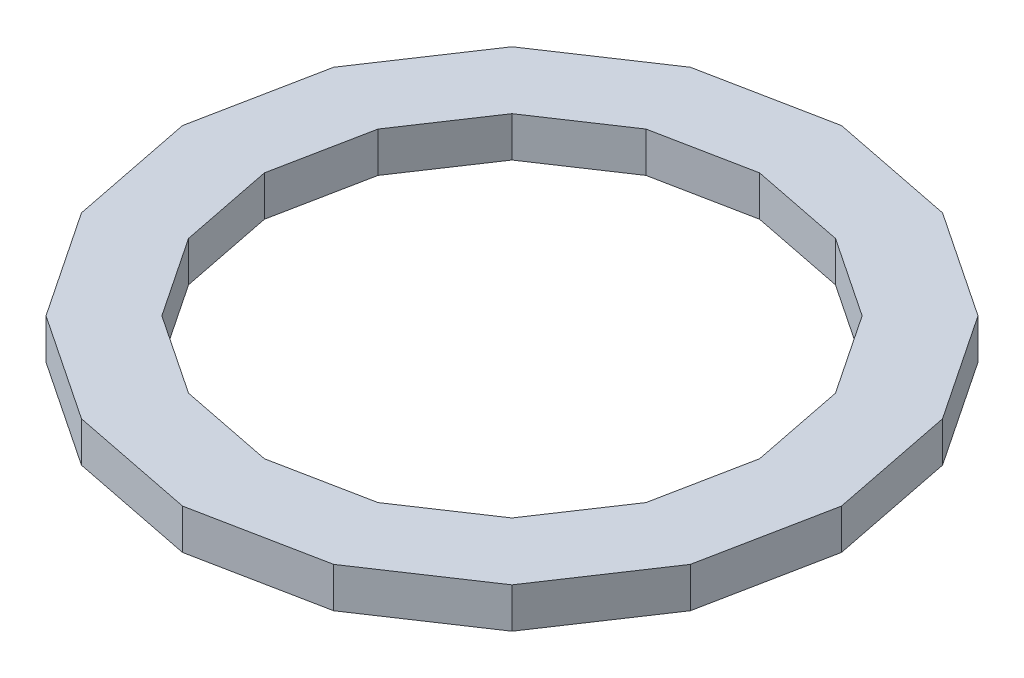
ISO-10303-21;
HEADER;
FILE_DESCRIPTION(('STEP AP214'),'2;1');
FILE_NAME('part.step','',(''),(''),'','','');
FILE_SCHEMA(('AUTOMOTIVE_DESIGN { 1 0 10303 214 1 1 1 1 }'));
ENDSEC;
DATA;
#1=APPLICATION_CONTEXT('core data for automotive mechanical design processes');
#2=APPLICATION_PROTOCOL_DEFINITION('international standard','automotive_design',2000,#1);
#3=PRODUCT_CONTEXT('',#1,'mechanical');
#4=PRODUCT('Part','Part','',(#3));
#5=PRODUCT_RELATED_PRODUCT_CATEGORY('part','',(#4));
#6=PRODUCT_DEFINITION_FORMATION('','',#4);
#7=PRODUCT_DEFINITION_CONTEXT('part definition',#1,'design');
#8=PRODUCT_DEFINITION('design','',#6,#7);
#9=PRODUCT_DEFINITION_SHAPE('','',#8);
#10=(LENGTH_UNIT() NAMED_UNIT(*) SI_UNIT(.MILLI.,.METRE.));
#11=(NAMED_UNIT(*) PLANE_ANGLE_UNIT() SI_UNIT($,.RADIAN.));
#12=(NAMED_UNIT(*) SI_UNIT($,.STERADIAN.) SOLID_ANGLE_UNIT());
#13=UNCERTAINTY_MEASURE_WITH_UNIT(LENGTH_MEASURE(1.E-05),#10,'distance_accuracy_value','');
#14=(GEOMETRIC_REPRESENTATION_CONTEXT(3) GLOBAL_UNCERTAINTY_ASSIGNED_CONTEXT((#13)) GLOBAL_UNIT_ASSIGNED_CONTEXT((#10,
#11,#12)) REPRESENTATION_CONTEXT('',''));
#15=CARTESIAN_POINT('',(0.,0.,0.));
#16=DIRECTION('',(0.,0.,1.));
#17=DIRECTION('',(1.,0.,0.));
#18=AXIS2_PLACEMENT_3D('',#15,#16,#17);
#19=CARTESIAN_POINT('',(0.,19.05,0.));
#20=DIRECTION('',(0.,1.,0.));
#21=DIRECTION('',(0.,0.,1.));
#22=AXIS2_PLACEMENT_3D('',#19,#20,#21);
#23=PLANE('',#22);
#24=DIRECTION('',(0.195090322016117,0.,-0.980785280403233));
#25=VECTOR('',#24,1.);
#26=CARTESIAN_POINT('',(144.34261966422,19.05,59.7886706933792));
#27=LINE('',#26,#25);
#28=CARTESIAN_POINT('',(144.34261966422,19.05,59.7886706933792));
#29=VERTEX_POINT('',#28);
#30=CARTESIAN_POINT('',(156.235325694322,19.05,-1.75900703643039E-12));
#31=VERTEX_POINT('',#30);
#32=EDGE_CURVE('E376',#29,#31,#27,.T.);
#33=ORIENTED_EDGE('',*,*,#32,.T.);
#34=DIRECTION('',(-0.19509032201614,0.,-0.980785280403228));
#35=VECTOR('',#34,1.);
#36=CARTESIAN_POINT('',(156.235325694322,19.05,-1.75900703643039E-12));
#37=LINE('',#36,#35);
#38=CARTESIAN_POINT('',(144.342619664218,19.05,-59.7886706933826));
#39=VERTEX_POINT('',#38);
#40=EDGE_CURVE('E379',#31,#39,#37,.T.);
#41=ORIENTED_EDGE('',*,*,#40,.T.);
#42=DIRECTION('',(-0.555570233019612,0.,-0.831469612302539));
#43=VECTOR('',#42,1.);
#44=CARTESIAN_POINT('',(144.342619664218,19.05,-59.7886706933826));
#45=LINE('',#44,#43);
#46=CARTESIAN_POINT('',(110.475058259343,19.05,-110.475058259345));
#47=VERTEX_POINT('',#46);
#48=EDGE_CURVE('E382',#39,#47,#45,.T.);
#49=ORIENTED_EDGE('',*,*,#48,.T.);
#50=DIRECTION('',(-0.831469612302552,0.,-0.555570233019593));
#51=VECTOR('',#50,1.);
#52=CARTESIAN_POINT('',(110.475058259343,19.05,-110.475058259345));
#53=LINE('',#52,#51);
#54=CARTESIAN_POINT('',(59.7886706933792,19.05,-144.34261966422));
#55=VERTEX_POINT('',#54);
#56=EDGE_CURVE('E384',#47,#55,#53,.T.);
#57=ORIENTED_EDGE('',*,*,#56,.T.);
#58=DIRECTION('',(-0.980785280403233,0.,-0.195090322016116));
#59=VECTOR('',#58,1.);
#60=CARTESIAN_POINT('',(59.7886706933792,19.05,-144.34261966422));
#61=LINE('',#60,#59);
#62=CARTESIAN_POINT('',(-1.74314644440105E-12,19.05,-156.235325694322));
#63=VERTEX_POINT('',#62);
#64=EDGE_CURVE('E386',#55,#63,#61,.T.);
#65=ORIENTED_EDGE('',*,*,#64,.T.);
#66=DIRECTION('',(-0.980785280403228,0.,0.195090322016139));
#67=VECTOR('',#66,1.);
#68=CARTESIAN_POINT('',(-1.74314644440105E-12,19.05,-156.235325694322));
#69=LINE('',#68,#67);
#70=CARTESIAN_POINT('',(-59.7886706933825,19.05,-144.342619664218));
#71=VERTEX_POINT('',#70);
#72=EDGE_CURVE('E388',#63,#71,#69,.T.);
#73=ORIENTED_EDGE('',*,*,#72,.T.);
#74=DIRECTION('',(-0.831469612302539,0.,0.555570233019612));
#75=VECTOR('',#74,1.);
#76=CARTESIAN_POINT('',(-59.7886706933825,19.05,-144.342619664218));
#77=LINE('',#76,#75);
#78=CARTESIAN_POINT('',(-110.475058259345,19.05,-110.475058259343));
#79=VERTEX_POINT('',#78);
#80=EDGE_CURVE('E390',#71,#79,#77,.T.);
#81=ORIENTED_EDGE('',*,*,#80,.T.);
#82=DIRECTION('',(-0.555570233019593,0.,0.831469612302552));
#83=VECTOR('',#82,1.);
#84=CARTESIAN_POINT('',(-110.475058259345,19.05,-110.475058259343));
#85=LINE('',#84,#83);
#86=CARTESIAN_POINT('',(-144.34261966422,19.05,-59.7886706933791));
#87=VERTEX_POINT('',#86);
#88=EDGE_CURVE('E392',#79,#87,#85,.T.);
#89=ORIENTED_EDGE('',*,*,#88,.T.);
#90=DIRECTION('',(-0.195090322016117,0.,0.980785280403233));
#91=VECTOR('',#90,1.);
#92=CARTESIAN_POINT('',(-144.34261966422,19.05,-59.7886706933791));
#93=LINE('',#92,#91);
#94=CARTESIAN_POINT('',(-156.235325694322,19.05,1.81308112107717E-12));
#95=VERTEX_POINT('',#94);
#96=EDGE_CURVE('E395',#87,#95,#93,.T.);
#97=ORIENTED_EDGE('',*,*,#96,.T.);
#98=DIRECTION('',(0.195090322016139,0.,0.980785280403228));
#99=VECTOR('',#98,1.);
#100=CARTESIAN_POINT('',(-156.235325694322,19.05,1.81308112107717E-12));
#101=LINE('',#100,#99);
#102=CARTESIAN_POINT('',(-144.342619664218,19.05,59.7886706933825));
#103=VERTEX_POINT('',#102);
#104=EDGE_CURVE('E397',#95,#103,#101,.T.);
#105=ORIENTED_EDGE('',*,*,#104,.T.);
#106=DIRECTION('',(0.555570233019612,0.,0.831469612302539));
#107=VECTOR('',#106,1.);
#108=CARTESIAN_POINT('',(-144.342619664218,19.05,59.7886706933825));
#109=LINE('',#108,#107);
#110=CARTESIAN_POINT('',(-110.475058259343,19.05,110.475058259345));
#111=VERTEX_POINT('',#110);
#112=EDGE_CURVE('E399',#103,#111,#109,.T.);
#113=ORIENTED_EDGE('',*,*,#112,.T.);
#114=DIRECTION('',(0.831469612302552,0.,0.555570233019593));
#115=VECTOR('',#114,1.);
#116=CARTESIAN_POINT('',(-110.475058259343,19.05,110.475058259345));
#117=LINE('',#116,#115);
#118=CARTESIAN_POINT('',(-59.7886706933792,19.05,144.34261966422));
#119=VERTEX_POINT('',#118);
#120=EDGE_CURVE('E402',#111,#119,#117,.T.);
#121=ORIENTED_EDGE('',*,*,#120,.T.);
#122=DIRECTION('',(0.980785280403233,0.,0.195090322016117));
#123=VECTOR('',#122,1.);
#124=CARTESIAN_POINT('',(-59.7886706933792,19.05,144.34261966422));
#125=LINE('',#124,#123);
#126=CARTESIAN_POINT('',(1.82717706537178E-12,19.05,156.235325694322));
#127=VERTEX_POINT('',#126);
#128=EDGE_CURVE('E405',#119,#127,#125,.T.);
#129=ORIENTED_EDGE('',*,*,#128,.T.);
#130=DIRECTION('',(0.980785280403228,0.,-0.195090322016139));
#131=VECTOR('',#130,1.);
#132=CARTESIAN_POINT('',(1.82717706537178E-12,19.05,156.235325694322));
#133=LINE('',#132,#131);
#134=CARTESIAN_POINT('',(59.7886706933825,19.05,144.342619664218));
#135=VERTEX_POINT('',#134);
#136=EDGE_CURVE('E407',#127,#135,#133,.T.);
#137=ORIENTED_EDGE('',*,*,#136,.T.);
#138=DIRECTION('',(0.831469612302539,0.,-0.555570233019612));
#139=VECTOR('',#138,1.);
#140=CARTESIAN_POINT('',(59.7886706933825,19.05,144.342619664218));
#141=LINE('',#140,#139);
#142=CARTESIAN_POINT('',(110.475058259345,19.05,110.475058259343));
#143=VERTEX_POINT('',#142);
#144=EDGE_CURVE('E410',#135,#143,#141,.T.);
#145=ORIENTED_EDGE('',*,*,#144,.T.);
#146=DIRECTION('',(0.555570233019592,0.,-0.831469612302552));
#147=VECTOR('',#146,1.);
#148=CARTESIAN_POINT('',(110.475058259345,19.05,110.475058259343));
#149=LINE('',#148,#147);
#150=EDGE_CURVE('E413',#143,#29,#149,.T.);
#151=ORIENTED_EDGE('',*,*,#150,.T.);
#152=EDGE_LOOP('',(#33,#41,#49,#57,#65,#73,#81,#89,#97,#105,#113,#121,#129,#137,#145,#151));
#153=FACE_BOUND('',#152,.T.);
#154=DIRECTION('',(-0.195090322016139,0.,-0.980785280403228));
#155=VECTOR('',#154,1.);
#156=CARTESIAN_POINT('',(117.388902566585,19.05,-1.41484433577876E-12));
#157=LINE('',#156,#155);
#158=CARTESIAN_POINT('',(117.388902566585,19.05,-1.41484433577876E-12));
#159=VERTEX_POINT('',#158);
#160=CARTESIAN_POINT('',(108.453204425229,19.05,-44.9227881557531));
#161=VERTEX_POINT('',#160);
#162=EDGE_CURVE('E252',#159,#161,#157,.T.);
#163=ORIENTED_EDGE('',*,*,#162,.F.);
#164=DIRECTION('',(0.195090322016117,0.,-0.980785280403233));
#165=VECTOR('',#164,1.);
#166=CARTESIAN_POINT('',(108.45320442523,19.05,44.9227881557506));
#167=LINE('',#166,#165);
#168=CARTESIAN_POINT('',(108.45320442523,19.05,44.9227881557506));
#169=VERTEX_POINT('',#168);
#170=EDGE_CURVE('E243',#169,#159,#167,.T.);
#171=ORIENTED_EDGE('',*,*,#170,.F.);
#172=DIRECTION('',(0.555570233019592,0.,-0.831469612302552));
#173=VECTOR('',#172,1.);
#174=CARTESIAN_POINT('',(83.0064890408802,19.05,83.0064890408783));
#175=LINE('',#174,#173);
#176=CARTESIAN_POINT('',(83.0064890408802,19.05,83.0064890408783));
#177=VERTEX_POINT('',#176);
#178=EDGE_CURVE('E296',#177,#169,#175,.T.);
#179=ORIENTED_EDGE('',*,*,#178,.F.);
#180=DIRECTION('',(0.831469612302539,0.,-0.555570233019612));
#181=VECTOR('',#180,1.);
#182=CARTESIAN_POINT('',(44.9227881557531,19.05,108.453204425229));
#183=LINE('',#182,#181);
#184=CARTESIAN_POINT('',(44.9227881557531,19.05,108.453204425229));
#185=VERTEX_POINT('',#184);
#186=EDGE_CURVE('E294',#185,#177,#183,.T.);
#187=ORIENTED_EDGE('',*,*,#186,.F.);
#188=DIRECTION('',(0.980785280403228,0.,-0.195090322016139));
#189=VECTOR('',#188,1.);
#190=CARTESIAN_POINT('',(1.35112482696358E-12,19.05,117.388902566585));
#191=LINE('',#190,#189);
#192=CARTESIAN_POINT('',(1.35112482696358E-12,19.05,117.388902566585));
#193=VERTEX_POINT('',#192);
#194=EDGE_CURVE('E292',#193,#185,#191,.T.);
#195=ORIENTED_EDGE('',*,*,#194,.F.);
#196=DIRECTION('',(0.980785280403233,0.,0.195090322016117));
#197=VECTOR('',#196,1.);
#198=CARTESIAN_POINT('',(-44.9227881557506,19.05,108.45320442523));
#199=LINE('',#198,#197);
#200=CARTESIAN_POINT('',(-44.9227881557506,19.05,108.45320442523));
#201=VERTEX_POINT('',#200);
#202=EDGE_CURVE('E290',#201,#193,#199,.T.);
#203=ORIENTED_EDGE('',*,*,#202,.F.);
#204=DIRECTION('',(0.831469612302552,0.,0.555570233019592));
#205=VECTOR('',#204,1.);
#206=CARTESIAN_POINT('',(-83.0064890408783,19.05,83.0064890408802));
#207=LINE('',#206,#205);
#208=CARTESIAN_POINT('',(-83.0064890408783,19.05,83.0064890408802));
#209=VERTEX_POINT('',#208);
#210=EDGE_CURVE('E288',#209,#201,#207,.T.);
#211=ORIENTED_EDGE('',*,*,#210,.F.);
#212=DIRECTION('',(0.555570233019612,0.,0.831469612302539));
#213=VECTOR('',#212,1.);
#214=CARTESIAN_POINT('',(-108.453204425229,19.05,44.9227881557532));
#215=LINE('',#214,#213);
#216=CARTESIAN_POINT('',(-108.453204425229,19.05,44.9227881557532));
#217=VERTEX_POINT('',#216);
#218=EDGE_CURVE('E285',#217,#209,#215,.T.);
#219=ORIENTED_EDGE('',*,*,#218,.F.);
#220=DIRECTION('',(0.19509032201614,0.,0.980785280403228));
#221=VECTOR('',#220,1.);
#222=CARTESIAN_POINT('',(-117.388902566585,19.05,1.38127980801458E-12));
#223=LINE('',#222,#221);
#224=CARTESIAN_POINT('',(-117.388902566585,19.05,1.38127980801458E-12));
#225=VERTEX_POINT('',#224);
#226=EDGE_CURVE('E283',#225,#217,#223,.T.);
#227=ORIENTED_EDGE('',*,*,#226,.F.);
#228=DIRECTION('',(-0.195090322016117,0.,0.980785280403233));
#229=VECTOR('',#228,1.);
#230=CARTESIAN_POINT('',(-108.45320442523,19.05,-44.9227881557506));
#231=LINE('',#230,#229);
#232=CARTESIAN_POINT('',(-108.45320442523,19.05,-44.9227881557506));
#233=VERTEX_POINT('',#232);
#234=EDGE_CURVE('E280',#233,#225,#231,.T.);
#235=ORIENTED_EDGE('',*,*,#234,.F.);
#236=DIRECTION('',(-0.555570233019592,0.,0.831469612302552));
#237=VECTOR('',#236,1.);
#238=CARTESIAN_POINT('',(-83.0064890408802,19.05,-83.0064890408783));
#239=LINE('',#238,#237);
#240=CARTESIAN_POINT('',(-83.0064890408802,19.05,-83.0064890408783));
#241=VERTEX_POINT('',#240);
#242=EDGE_CURVE('E277',#241,#233,#239,.T.);
#243=ORIENTED_EDGE('',*,*,#242,.F.);
#244=DIRECTION('',(-0.831469612302539,0.,0.555570233019612));
#245=VECTOR('',#244,1.);
#246=CARTESIAN_POINT('',(-44.9227881557531,19.05,-108.453204425229));
#247=LINE('',#246,#245);
#248=CARTESIAN_POINT('',(-44.9227881557531,19.05,-108.453204425229));
#249=VERTEX_POINT('',#248);
#250=EDGE_CURVE('E275',#249,#241,#247,.T.);
#251=ORIENTED_EDGE('',*,*,#250,.F.);
#252=DIRECTION('',(-0.980785280403228,0.,0.19509032201614));
#253=VECTOR('',#252,1.);
#254=CARTESIAN_POINT('',(-1.40097410009201E-12,19.05,-117.388902566585));
#255=LINE('',#254,#253);
#256=CARTESIAN_POINT('',(-1.40097410009201E-12,19.05,-117.388902566585));
#257=VERTEX_POINT('',#256);
#258=EDGE_CURVE('E273',#257,#249,#255,.T.);
#259=ORIENTED_EDGE('',*,*,#258,.F.);
#260=DIRECTION('',(-0.980785280403233,0.,-0.195090322016117));
#261=VECTOR('',#260,1.);
#262=CARTESIAN_POINT('',(44.9227881557507,19.05,-108.45320442523));
#263=LINE('',#262,#261);
#264=CARTESIAN_POINT('',(44.9227881557507,19.05,-108.45320442523));
#265=VERTEX_POINT('',#264);
#266=EDGE_CURVE('E271',#265,#257,#263,.T.);
#267=ORIENTED_EDGE('',*,*,#266,.F.);
#268=DIRECTION('',(-0.831469612302552,0.,-0.555570233019593));
#269=VECTOR('',#268,1.);
#270=CARTESIAN_POINT('',(83.0064890408783,19.05,-83.0064890408802));
#271=LINE('',#270,#269);
#272=CARTESIAN_POINT('',(83.0064890408783,19.05,-83.0064890408802));
#273=VERTEX_POINT('',#272);
#274=EDGE_CURVE('E267',#273,#265,#271,.T.);
#275=ORIENTED_EDGE('',*,*,#274,.F.);
#276=DIRECTION('',(-0.555570233019612,0.,-0.831469612302539));
#277=VECTOR('',#276,1.);
#278=CARTESIAN_POINT('',(108.453204425229,19.05,-44.9227881557531));
#279=LINE('',#278,#277);
#280=EDGE_CURVE('E265',#161,#273,#279,.T.);
#281=ORIENTED_EDGE('',*,*,#280,.F.);
#282=EDGE_LOOP('',(#163,#171,#179,#187,#195,#203,#211,#219,#227,#235,#243,#251,#259,#267,#275,#281));
#283=FACE_BOUND('',#282,.T.);
#284=ADVANCED_FACE('F34',(#153,#283),#23,.T.);
#285=CARTESIAN_POINT('',(0.,0.,0.));
#286=DIRECTION('',(0.,1.,0.));
#287=DIRECTION('',(0.,0.,1.));
#288=AXIS2_PLACEMENT_3D('',#285,#286,#287);
#289=PLANE('',#288);
#290=DIRECTION('',(0.195090322016117,0.,-0.980785280403233));
#291=VECTOR('',#290,1.);
#292=CARTESIAN_POINT('',(144.34261966422,0.,59.7886706933792));
#293=LINE('',#292,#291);
#294=CARTESIAN_POINT('',(144.34261966422,0.,59.7886706933792));
#295=VERTEX_POINT('',#294);
#296=CARTESIAN_POINT('',(156.235325694322,0.,-1.75900703643039E-12));
#297=VERTEX_POINT('',#296);
#298=EDGE_CURVE('E260',#295,#297,#293,.T.);
#299=ORIENTED_EDGE('',*,*,#298,.F.);
#300=DIRECTION('',(0.555570233019592,0.,-0.831469612302552));
#301=VECTOR('',#300,1.);
#302=CARTESIAN_POINT('',(110.475058259345,0.,110.475058259343));
#303=LINE('',#302,#301);
#304=CARTESIAN_POINT('',(110.475058259345,0.,110.475058259343));
#305=VERTEX_POINT('',#304);
#306=EDGE_CURVE('E380',#305,#295,#303,.T.);
#307=ORIENTED_EDGE('',*,*,#306,.F.);
#308=DIRECTION('',(0.831469612302539,0.,-0.555570233019612));
#309=VECTOR('',#308,1.);
#310=CARTESIAN_POINT('',(59.7886706933825,0.,144.342619664218));
#311=LINE('',#310,#309);
#312=CARTESIAN_POINT('',(59.7886706933825,0.,144.342619664218));
#313=VERTEX_POINT('',#312);
#314=EDGE_CURVE('E448',#313,#305,#311,.T.);
#315=ORIENTED_EDGE('',*,*,#314,.F.);
#316=DIRECTION('',(0.980785280403228,0.,-0.195090322016139));
#317=VECTOR('',#316,1.);
#318=CARTESIAN_POINT('',(1.82717706537178E-12,0.,156.235325694322));
#319=LINE('',#318,#317);
#320=CARTESIAN_POINT('',(1.82717706537178E-12,0.,156.235325694322));
#321=VERTEX_POINT('',#320);
#322=EDGE_CURVE('E445',#321,#313,#319,.T.);
#323=ORIENTED_EDGE('',*,*,#322,.F.);
#324=DIRECTION('',(0.980785280403233,0.,0.195090322016117));
#325=VECTOR('',#324,1.);
#326=CARTESIAN_POINT('',(-59.7886706933792,0.,144.34261966422));
#327=LINE('',#326,#325);
#328=CARTESIAN_POINT('',(-59.7886706933792,0.,144.34261966422));
#329=VERTEX_POINT('',#328);
#330=EDGE_CURVE('E442',#329,#321,#327,.T.);
#331=ORIENTED_EDGE('',*,*,#330,.F.);
#332=DIRECTION('',(0.831469612302552,0.,0.555570233019593));
#333=VECTOR('',#332,1.);
#334=CARTESIAN_POINT('',(-110.475058259343,0.,110.475058259345));
#335=LINE('',#334,#333);
#336=CARTESIAN_POINT('',(-110.475058259343,0.,110.475058259345));
#337=VERTEX_POINT('',#336);
#338=EDGE_CURVE('E439',#337,#329,#335,.T.);
#339=ORIENTED_EDGE('',*,*,#338,.F.);
#340=DIRECTION('',(0.555570233019612,0.,0.831469612302539));
#341=VECTOR('',#340,1.);
#342=CARTESIAN_POINT('',(-144.342619664218,0.,59.7886706933825));
#343=LINE('',#342,#341);
#344=CARTESIAN_POINT('',(-144.342619664218,0.,59.7886706933825));
#345=VERTEX_POINT('',#344);
#346=EDGE_CURVE('E437',#345,#337,#343,.T.);
#347=ORIENTED_EDGE('',*,*,#346,.F.);
#348=DIRECTION('',(0.195090322016139,0.,0.980785280403228));
#349=VECTOR('',#348,1.);
#350=CARTESIAN_POINT('',(-156.235325694322,0.,1.81308112107717E-12));
#351=LINE('',#350,#349);
#352=CARTESIAN_POINT('',(-156.235325694322,0.,1.81308112107717E-12));
#353=VERTEX_POINT('',#352);
#354=EDGE_CURVE('E434',#353,#345,#351,.T.);
#355=ORIENTED_EDGE('',*,*,#354,.F.);
#356=DIRECTION('',(-0.195090322016117,0.,0.980785280403233));
#357=VECTOR('',#356,1.);
#358=CARTESIAN_POINT('',(-144.34261966422,0.,-59.7886706933791));
#359=LINE('',#358,#357);
#360=CARTESIAN_POINT('',(-144.34261966422,0.,-59.7886706933791));
#361=VERTEX_POINT('',#360);
#362=EDGE_CURVE('E432',#361,#353,#359,.T.);
#363=ORIENTED_EDGE('',*,*,#362,.F.);
#364=DIRECTION('',(-0.555570233019593,0.,0.831469612302552));
#365=VECTOR('',#364,1.);
#366=CARTESIAN_POINT('',(-110.475058259345,0.,-110.475058259343));
#367=LINE('',#366,#365);
#368=CARTESIAN_POINT('',(-110.475058259345,0.,-110.475058259343));
#369=VERTEX_POINT('',#368);
#370=EDGE_CURVE('E430',#369,#361,#367,.T.);
#371=ORIENTED_EDGE('',*,*,#370,.F.);
#372=DIRECTION('',(-0.831469612302539,0.,0.555570233019612));
#373=VECTOR('',#372,1.);
#374=CARTESIAN_POINT('',(-59.7886706933825,0.,-144.342619664218));
#375=LINE('',#374,#373);
#376=CARTESIAN_POINT('',(-59.7886706933825,0.,-144.342619664218));
#377=VERTEX_POINT('',#376);
#378=EDGE_CURVE('E428',#377,#369,#375,.T.);
#379=ORIENTED_EDGE('',*,*,#378,.F.);
#380=DIRECTION('',(-0.980785280403228,0.,0.195090322016139));
#381=VECTOR('',#380,1.);
#382=CARTESIAN_POINT('',(-1.74314644440105E-12,0.,-156.235325694322));
#383=LINE('',#382,#381);
#384=CARTESIAN_POINT('',(-1.74314644440105E-12,0.,-156.235325694322));
#385=VERTEX_POINT('',#384);
#386=EDGE_CURVE('E426',#385,#377,#383,.T.);
#387=ORIENTED_EDGE('',*,*,#386,.F.);
#388=DIRECTION('',(-0.980785280403233,0.,-0.195090322016116));
#389=VECTOR('',#388,1.);
#390=CARTESIAN_POINT('',(59.7886706933792,0.,-144.34261966422));
#391=LINE('',#390,#389);
#392=CARTESIAN_POINT('',(59.7886706933792,0.,-144.34261966422));
#393=VERTEX_POINT('',#392);
#394=EDGE_CURVE('E424',#393,#385,#391,.T.);
#395=ORIENTED_EDGE('',*,*,#394,.F.);
#396=DIRECTION('',(-0.831469612302552,0.,-0.555570233019593));
#397=VECTOR('',#396,1.);
#398=CARTESIAN_POINT('',(110.475058259343,0.,-110.475058259345));
#399=LINE('',#398,#397);
#400=CARTESIAN_POINT('',(110.475058259343,0.,-110.475058259345));
#401=VERTEX_POINT('',#400);
#402=EDGE_CURVE('E422',#401,#393,#399,.T.);
#403=ORIENTED_EDGE('',*,*,#402,.F.);
#404=DIRECTION('',(-0.555570233019612,0.,-0.831469612302539));
#405=VECTOR('',#404,1.);
#406=CARTESIAN_POINT('',(144.342619664218,0.,-59.7886706933826));
#407=LINE('',#406,#405);
#408=CARTESIAN_POINT('',(144.342619664218,0.,-59.7886706933826));
#409=VERTEX_POINT('',#408);
#410=EDGE_CURVE('E420',#409,#401,#407,.T.);
#411=ORIENTED_EDGE('',*,*,#410,.F.);
#412=DIRECTION('',(-0.19509032201614,0.,-0.980785280403228));
#413=VECTOR('',#412,1.);
#414=CARTESIAN_POINT('',(156.235325694322,0.,-1.75900703643039E-12));
#415=LINE('',#414,#413);
#416=EDGE_CURVE('E418',#297,#409,#415,.T.);
#417=ORIENTED_EDGE('',*,*,#416,.F.);
#418=EDGE_LOOP('',(#299,#307,#315,#323,#331,#339,#347,#355,#363,#371,#379,#387,#395,#403,#411,#417));
#419=FACE_BOUND('',#418,.T.);
#420=DIRECTION('',(0.195090322016117,0.,-0.980785280403233));
#421=VECTOR('',#420,1.);
#422=CARTESIAN_POINT('',(108.45320442523,0.,44.9227881557506));
#423=LINE('',#422,#421);
#424=CARTESIAN_POINT('',(108.45320442523,0.,44.9227881557506));
#425=VERTEX_POINT('',#424);
#426=CARTESIAN_POINT('',(117.388902566585,0.,-1.41484433577876E-12));
#427=VERTEX_POINT('',#426);
#428=EDGE_CURVE('E57',#425,#427,#423,.T.);
#429=ORIENTED_EDGE('',*,*,#428,.T.);
#430=DIRECTION('',(-0.195090322016139,0.,-0.980785280403228));
#431=VECTOR('',#430,1.);
#432=CARTESIAN_POINT('',(117.388902566585,0.,-1.41484433577876E-12));
#433=LINE('',#432,#431);
#434=CARTESIAN_POINT('',(108.453204425229,0.,-44.9227881557531));
#435=VERTEX_POINT('',#434);
#436=EDGE_CURVE('E259',#427,#435,#433,.T.);
#437=ORIENTED_EDGE('',*,*,#436,.T.);
#438=DIRECTION('',(-0.555570233019612,0.,-0.831469612302539));
#439=VECTOR('',#438,1.);
#440=CARTESIAN_POINT('',(108.453204425229,0.,-44.9227881557531));
#441=LINE('',#440,#439);
#442=CARTESIAN_POINT('',(83.0064890408783,0.,-83.0064890408802));
#443=VERTEX_POINT('',#442);
#444=EDGE_CURVE('E300',#435,#443,#441,.T.);
#445=ORIENTED_EDGE('',*,*,#444,.T.);
#446=DIRECTION('',(-0.831469612302552,0.,-0.555570233019593));
#447=VECTOR('',#446,1.);
#448=CARTESIAN_POINT('',(83.0064890408783,0.,-83.0064890408802));
#449=LINE('',#448,#447);
#450=CARTESIAN_POINT('',(44.9227881557507,0.,-108.45320442523));
#451=VERTEX_POINT('',#450);
#452=EDGE_CURVE('E303',#443,#451,#449,.T.);
#453=ORIENTED_EDGE('',*,*,#452,.T.);
#454=DIRECTION('',(-0.980785280403233,0.,-0.195090322016117));
#455=VECTOR('',#454,1.);
#456=CARTESIAN_POINT('',(44.9227881557507,0.,-108.45320442523));
#457=LINE('',#456,#455);
#458=CARTESIAN_POINT('',(-1.40097410009201E-12,0.,-117.388902566585));
#459=VERTEX_POINT('',#458);
#460=EDGE_CURVE('E306',#451,#459,#457,.T.);
#461=ORIENTED_EDGE('',*,*,#460,.T.);
#462=DIRECTION('',(-0.980785280403228,0.,0.19509032201614));
#463=VECTOR('',#462,1.);
#464=CARTESIAN_POINT('',(-1.40097410009201E-12,0.,-117.388902566585));
#465=LINE('',#464,#463);
#466=CARTESIAN_POINT('',(-44.9227881557531,0.,-108.453204425229));
#467=VERTEX_POINT('',#466);
#468=EDGE_CURVE('E310',#459,#467,#465,.T.);
#469=ORIENTED_EDGE('',*,*,#468,.T.);
#470=DIRECTION('',(-0.831469612302539,0.,0.555570233019612));
#471=VECTOR('',#470,1.);
#472=CARTESIAN_POINT('',(-44.9227881557531,0.,-108.453204425229));
#473=LINE('',#472,#471);
#474=CARTESIAN_POINT('',(-83.0064890408802,0.,-83.0064890408783));
#475=VERTEX_POINT('',#474);
#476=EDGE_CURVE('E313',#467,#475,#473,.T.);
#477=ORIENTED_EDGE('',*,*,#476,.T.);
#478=DIRECTION('',(-0.555570233019592,0.,0.831469612302552));
#479=VECTOR('',#478,1.);
#480=CARTESIAN_POINT('',(-83.0064890408802,0.,-83.0064890408783));
#481=LINE('',#480,#479);
#482=CARTESIAN_POINT('',(-108.45320442523,0.,-44.9227881557506));
#483=VERTEX_POINT('',#482);
#484=EDGE_CURVE('E316',#475,#483,#481,.T.);
#485=ORIENTED_EDGE('',*,*,#484,.T.);
#486=DIRECTION('',(-0.195090322016117,0.,0.980785280403233));
#487=VECTOR('',#486,1.);
#488=CARTESIAN_POINT('',(-108.45320442523,0.,-44.9227881557506));
#489=LINE('',#488,#487);
#490=CARTESIAN_POINT('',(-117.388902566585,0.,1.38127980801458E-12));
#491=VERTEX_POINT('',#490);
#492=EDGE_CURVE('E319',#483,#491,#489,.T.);
#493=ORIENTED_EDGE('',*,*,#492,.T.);
#494=DIRECTION('',(0.19509032201614,0.,0.980785280403228));
#495=VECTOR('',#494,1.);
#496=CARTESIAN_POINT('',(-117.388902566585,0.,1.38127980801458E-12));
#497=LINE('',#496,#495);
#498=CARTESIAN_POINT('',(-108.453204425229,0.,44.9227881557532));
#499=VERTEX_POINT('',#498);
#500=EDGE_CURVE('E323',#491,#499,#497,.T.);
#501=ORIENTED_EDGE('',*,*,#500,.T.);
#502=DIRECTION('',(0.555570233019612,0.,0.831469612302539));
#503=VECTOR('',#502,1.);
#504=CARTESIAN_POINT('',(-108.453204425229,0.,44.9227881557532));
#505=LINE('',#504,#503);
#506=CARTESIAN_POINT('',(-83.0064890408783,0.,83.0064890408802));
#507=VERTEX_POINT('',#506);
#508=EDGE_CURVE('E326',#499,#507,#505,.T.);
#509=ORIENTED_EDGE('',*,*,#508,.T.);
#510=DIRECTION('',(0.831469612302552,0.,0.555570233019592));
#511=VECTOR('',#510,1.);
#512=CARTESIAN_POINT('',(-83.0064890408783,0.,83.0064890408802));
#513=LINE('',#512,#511);
#514=CARTESIAN_POINT('',(-44.9227881557506,0.,108.45320442523));
#515=VERTEX_POINT('',#514);
#516=EDGE_CURVE('E330',#507,#515,#513,.T.);
#517=ORIENTED_EDGE('',*,*,#516,.T.);
#518=DIRECTION('',(0.980785280403233,0.,0.195090322016117));
#519=VECTOR('',#518,1.);
#520=CARTESIAN_POINT('',(-44.9227881557506,0.,108.45320442523));
#521=LINE('',#520,#519);
#522=CARTESIAN_POINT('',(1.35112482696358E-12,0.,117.388902566585));
#523=VERTEX_POINT('',#522);
#524=EDGE_CURVE('E333',#515,#523,#521,.T.);
#525=ORIENTED_EDGE('',*,*,#524,.T.);
#526=DIRECTION('',(0.980785280403228,0.,-0.195090322016139));
#527=VECTOR('',#526,1.);
#528=CARTESIAN_POINT('',(1.35112482696358E-12,0.,117.388902566585));
#529=LINE('',#528,#527);
#530=CARTESIAN_POINT('',(44.9227881557531,0.,108.453204425229));
#531=VERTEX_POINT('',#530);
#532=EDGE_CURVE('E336',#523,#531,#529,.T.);
#533=ORIENTED_EDGE('',*,*,#532,.T.);
#534=DIRECTION('',(0.831469612302539,0.,-0.555570233019612));
#535=VECTOR('',#534,1.);
#536=CARTESIAN_POINT('',(44.9227881557531,0.,108.453204425229));
#537=LINE('',#536,#535);
#538=CARTESIAN_POINT('',(83.0064890408802,0.,83.0064890408783));
#539=VERTEX_POINT('',#538);
#540=EDGE_CURVE('E340',#531,#539,#537,.T.);
#541=ORIENTED_EDGE('',*,*,#540,.T.);
#542=DIRECTION('',(0.555570233019592,0.,-0.831469612302552));
#543=VECTOR('',#542,1.);
#544=CARTESIAN_POINT('',(83.0064890408802,0.,83.0064890408783));
#545=LINE('',#544,#543);
#546=EDGE_CURVE('E253',#539,#425,#545,.T.);
#547=ORIENTED_EDGE('',*,*,#546,.T.);
#548=EDGE_LOOP('',(#429,#437,#445,#453,#461,#469,#477,#485,#493,#501,#509,#517,#525,#533,#541,#547));
#549=FACE_BOUND('',#548,.T.);
#550=ADVANCED_FACE('F505',(#419,#549),#289,.F.);
#551=CARTESIAN_POINT('',(144.34261966422,19.05,59.7886706933792));
#552=DIRECTION('',(-0.980785280403233,0.,-0.195090322016117));
#553=DIRECTION('',(-0.195090322016117,0.,0.980785280403233));
#554=AXIS2_PLACEMENT_3D('',#551,#552,#553);
#555=PLANE('',#554);
#556=ORIENTED_EDGE('',*,*,#298,.T.);
#557=DIRECTION('',(0.,-1.,0.));
#558=VECTOR('',#557,1.);
#559=CARTESIAN_POINT('',(156.235325694322,19.05,-1.75900703643039E-12));
#560=LINE('',#559,#558);
#561=EDGE_CURVE('E11',#31,#297,#560,.T.);
#562=ORIENTED_EDGE('',*,*,#561,.F.);
#563=ORIENTED_EDGE('',*,*,#32,.F.);
#564=DIRECTION('',(0.,-1.,0.));
#565=VECTOR('',#564,1.);
#566=CARTESIAN_POINT('',(144.34261966422,19.05,59.7886706933792));
#567=LINE('',#566,#565);
#568=EDGE_CURVE('E415',#29,#295,#567,.T.);
#569=ORIENTED_EDGE('',*,*,#568,.T.);
#570=EDGE_LOOP('',(#556,#562,#563,#569));
#571=FACE_BOUND('',#570,.T.);
#572=ADVANCED_FACE('F36',(#571),#555,.F.);
#573=CARTESIAN_POINT('',(156.235325694322,19.05,-1.75900703643039E-12));
#574=DIRECTION('',(-0.980785280403228,0.,0.19509032201614));
#575=DIRECTION('',(0.19509032201614,0.,0.980785280403228));
#576=AXIS2_PLACEMENT_3D('',#573,#574,#575);
#577=PLANE('',#576);
#578=ORIENTED_EDGE('',*,*,#416,.T.);
#579=DIRECTION('',(0.,-1.,0.));
#580=VECTOR('',#579,1.);
#581=CARTESIAN_POINT('',(144.342619664218,19.05,-59.7886706933826));
#582=LINE('',#581,#580);
#583=EDGE_CURVE('E42',#39,#409,#582,.T.);
#584=ORIENTED_EDGE('',*,*,#583,.F.);
#585=ORIENTED_EDGE('',*,*,#40,.F.);
#586=ORIENTED_EDGE('',*,*,#561,.T.);
#587=EDGE_LOOP('',(#578,#584,#585,#586));
#588=FACE_BOUND('',#587,.T.);
#589=ADVANCED_FACE('F522',(#588),#577,.F.);
#590=CARTESIAN_POINT('',(144.342619664218,19.05,-59.7886706933826));
#591=DIRECTION('',(-0.831469612302539,0.,0.555570233019612));
#592=DIRECTION('',(0.555570233019612,0.,0.831469612302539));
#593=AXIS2_PLACEMENT_3D('',#590,#591,#592);
#594=PLANE('',#593);
#595=ORIENTED_EDGE('',*,*,#410,.T.);
#596=DIRECTION('',(0.,-1.,0.));
#597=VECTOR('',#596,1.);
#598=CARTESIAN_POINT('',(110.475058259343,19.05,-110.475058259345));
#599=LINE('',#598,#597);
#600=EDGE_CURVE('E492',#47,#401,#599,.T.);
#601=ORIENTED_EDGE('',*,*,#600,.F.);
#602=ORIENTED_EDGE('',*,*,#48,.F.);
#603=ORIENTED_EDGE('',*,*,#583,.T.);
#604=EDGE_LOOP('',(#595,#601,#602,#603));
#605=FACE_BOUND('',#604,.T.);
#606=ADVANCED_FACE('F499',(#605),#594,.F.);
#607=CARTESIAN_POINT('',(110.475058259343,19.05,-110.475058259345));
#608=DIRECTION('',(-0.555570233019592,0.,0.831469612302552));
#609=DIRECTION('',(0.831469612302552,0.,0.555570233019593));
#610=AXIS2_PLACEMENT_3D('',#607,#608,#609);
#611=PLANE('',#610);
#612=ORIENTED_EDGE('',*,*,#402,.T.);
#613=DIRECTION('',(0.,-1.,0.));
#614=VECTOR('',#613,1.);
#615=CARTESIAN_POINT('',(59.7886706933792,19.05,-144.34261966422));
#616=LINE('',#615,#614);
#617=EDGE_CURVE('E488',#55,#393,#616,.T.);
#618=ORIENTED_EDGE('',*,*,#617,.F.);
#619=ORIENTED_EDGE('',*,*,#56,.F.);
#620=ORIENTED_EDGE('',*,*,#600,.T.);
#621=EDGE_LOOP('',(#612,#618,#619,#620));
#622=FACE_BOUND('',#621,.T.);
#623=ADVANCED_FACE('F511',(#622),#611,.F.);
#624=CARTESIAN_POINT('',(59.7886706933792,19.05,-144.34261966422));
#625=DIRECTION('',(-0.195090322016116,0.,0.980785280403233));
#626=DIRECTION('',(0.980785280403233,0.,0.195090322016116));
#627=AXIS2_PLACEMENT_3D('',#624,#625,#626);
#628=PLANE('',#627);
#629=ORIENTED_EDGE('',*,*,#394,.T.);
#630=DIRECTION('',(0.,-1.,0.));
#631=VECTOR('',#630,1.);
#632=CARTESIAN_POINT('',(-1.74314644440105E-12,19.05,-156.235325694322));
#633=LINE('',#632,#631);
#634=EDGE_CURVE('E485',#63,#385,#633,.T.);
#635=ORIENTED_EDGE('',*,*,#634,.F.);
#636=ORIENTED_EDGE('',*,*,#64,.F.);
#637=ORIENTED_EDGE('',*,*,#617,.T.);
#638=EDGE_LOOP('',(#629,#635,#636,#637));
#639=FACE_BOUND('',#638,.T.);
#640=ADVANCED_FACE('F515',(#639),#628,.F.);
#641=CARTESIAN_POINT('',(-1.74314644440105E-12,19.05,-156.235325694322));
#642=DIRECTION('',(0.195090322016139,0.,0.980785280403228));
#643=DIRECTION('',(0.980785280403228,0.,-0.195090322016139));
#644=AXIS2_PLACEMENT_3D('',#641,#642,#643);
#645=PLANE('',#644);
#646=ORIENTED_EDGE('',*,*,#386,.T.);
#647=DIRECTION('',(0.,-1.,0.));
#648=VECTOR('',#647,1.);
#649=CARTESIAN_POINT('',(-59.7886706933825,19.05,-144.342619664218));
#650=LINE('',#649,#648);
#651=EDGE_CURVE('E482',#71,#377,#650,.T.);
#652=ORIENTED_EDGE('',*,*,#651,.F.);
#653=ORIENTED_EDGE('',*,*,#72,.F.);
#654=ORIENTED_EDGE('',*,*,#634,.T.);
#655=EDGE_LOOP('',(#646,#652,#653,#654));
#656=FACE_BOUND('',#655,.T.);
#657=ADVANCED_FACE('F575',(#656),#645,.F.);
#658=CARTESIAN_POINT('',(-59.7886706933825,19.05,-144.342619664218));
#659=DIRECTION('',(0.555570233019612,0.,0.831469612302539));
#660=DIRECTION('',(0.831469612302539,0.,-0.555570233019612));
#661=AXIS2_PLACEMENT_3D('',#658,#659,#660);
#662=PLANE('',#661);
#663=ORIENTED_EDGE('',*,*,#378,.T.);
#664=DIRECTION('',(0.,-1.,0.));
#665=VECTOR('',#664,1.);
#666=CARTESIAN_POINT('',(-110.475058259345,19.05,-110.475058259343));
#667=LINE('',#666,#665);
#668=EDGE_CURVE('E479',#79,#369,#667,.T.);
#669=ORIENTED_EDGE('',*,*,#668,.F.);
#670=ORIENTED_EDGE('',*,*,#80,.F.);
#671=ORIENTED_EDGE('',*,*,#651,.T.);
#672=EDGE_LOOP('',(#663,#669,#670,#671));
#673=FACE_BOUND('',#672,.T.);
#674=ADVANCED_FACE('F572',(#673),#662,.F.);
#675=CARTESIAN_POINT('',(-110.475058259345,19.05,-110.475058259343));
#676=DIRECTION('',(0.831469612302552,0.,0.555570233019593));
#677=DIRECTION('',(0.555570233019593,0.,-0.831469612302552));
#678=AXIS2_PLACEMENT_3D('',#675,#676,#677);
#679=PLANE('',#678);
#680=ORIENTED_EDGE('',*,*,#370,.T.);
#681=DIRECTION('',(0.,-1.,0.));
#682=VECTOR('',#681,1.);
#683=CARTESIAN_POINT('',(-144.34261966422,19.05,-59.7886706933791));
#684=LINE('',#683,#682);
#685=EDGE_CURVE('E476',#87,#361,#684,.T.);
#686=ORIENTED_EDGE('',*,*,#685,.F.);
#687=ORIENTED_EDGE('',*,*,#88,.F.);
#688=ORIENTED_EDGE('',*,*,#668,.T.);
#689=EDGE_LOOP('',(#680,#686,#687,#688));
#690=FACE_BOUND('',#689,.T.);
#691=ADVANCED_FACE('F568',(#690),#679,.F.);
#692=CARTESIAN_POINT('',(-144.34261966422,19.05,-59.7886706933791));
#693=DIRECTION('',(0.980785280403233,0.,0.195090322016117));
#694=DIRECTION('',(0.195090322016117,0.,-0.980785280403233));
#695=AXIS2_PLACEMENT_3D('',#692,#693,#694);
#696=PLANE('',#695);
#697=ORIENTED_EDGE('',*,*,#362,.T.);
#698=DIRECTION('',(0.,-1.,0.));
#699=VECTOR('',#698,1.);
#700=CARTESIAN_POINT('',(-156.235325694322,19.05,1.81308112107717E-12));
#701=LINE('',#700,#699);
#702=EDGE_CURVE('E473',#95,#353,#701,.T.);
#703=ORIENTED_EDGE('',*,*,#702,.F.);
#704=ORIENTED_EDGE('',*,*,#96,.F.);
#705=ORIENTED_EDGE('',*,*,#685,.T.);
#706=EDGE_LOOP('',(#697,#703,#704,#705));
#707=FACE_BOUND('',#706,.T.);
#708=ADVANCED_FACE('F564',(#707),#696,.F.);
#709=CARTESIAN_POINT('',(-156.235325694322,19.05,1.81308112107717E-12));
#710=DIRECTION('',(0.980785280403228,0.,-0.195090322016139));
#711=DIRECTION('',(-0.195090322016139,0.,-0.980785280403228));
#712=AXIS2_PLACEMENT_3D('',#709,#710,#711);
#713=PLANE('',#712);
#714=ORIENTED_EDGE('',*,*,#354,.T.);
#715=DIRECTION('',(0.,-1.,0.));
#716=VECTOR('',#715,1.);
#717=CARTESIAN_POINT('',(-144.342619664218,19.05,59.7886706933825));
#718=LINE('',#717,#716);
#719=EDGE_CURVE('E469',#103,#345,#718,.T.);
#720=ORIENTED_EDGE('',*,*,#719,.F.);
#721=ORIENTED_EDGE('',*,*,#104,.F.);
#722=ORIENTED_EDGE('',*,*,#702,.T.);
#723=EDGE_LOOP('',(#714,#720,#721,#722));
#724=FACE_BOUND('',#723,.T.);
#725=ADVANCED_FACE('F559',(#724),#713,.F.);
#726=CARTESIAN_POINT('',(-144.342619664218,19.05,59.7886706933825));
#727=DIRECTION('',(0.831469612302539,0.,-0.555570233019612));
#728=DIRECTION('',(-0.555570233019612,0.,-0.831469612302539));
#729=AXIS2_PLACEMENT_3D('',#726,#727,#728);
#730=PLANE('',#729);
#731=ORIENTED_EDGE('',*,*,#346,.T.);
#732=DIRECTION('',(0.,-1.,0.));
#733=VECTOR('',#732,1.);
#734=CARTESIAN_POINT('',(-110.475058259343,19.05,110.475058259345));
#735=LINE('',#734,#733);
#736=EDGE_CURVE('E466',#111,#337,#735,.T.);
#737=ORIENTED_EDGE('',*,*,#736,.F.);
#738=ORIENTED_EDGE('',*,*,#112,.F.);
#739=ORIENTED_EDGE('',*,*,#719,.T.);
#740=EDGE_LOOP('',(#731,#737,#738,#739));
#741=FACE_BOUND('',#740,.T.);
#742=ADVANCED_FACE('F553',(#741),#730,.F.);
#743=CARTESIAN_POINT('',(-110.475058259343,19.05,110.475058259345));
#744=DIRECTION('',(0.555570233019592,0.,-0.831469612302552));
#745=DIRECTION('',(-0.831469612302552,0.,-0.555570233019593));
#746=AXIS2_PLACEMENT_3D('',#743,#744,#745);
#747=PLANE('',#746);
#748=ORIENTED_EDGE('',*,*,#338,.T.);
#749=DIRECTION('',(0.,-1.,0.));
#750=VECTOR('',#749,1.);
#751=CARTESIAN_POINT('',(-59.7886706933792,19.05,144.34261966422));
#752=LINE('',#751,#750);
#753=EDGE_CURVE('E463',#119,#329,#752,.T.);
#754=ORIENTED_EDGE('',*,*,#753,.F.);
#755=ORIENTED_EDGE('',*,*,#120,.F.);
#756=ORIENTED_EDGE('',*,*,#736,.T.);
#757=EDGE_LOOP('',(#748,#754,#755,#756));
#758=FACE_BOUND('',#757,.T.);
#759=ADVANCED_FACE('F549',(#758),#747,.F.);
#760=CARTESIAN_POINT('',(-59.7886706933792,19.05,144.34261966422));
#761=DIRECTION('',(0.195090322016117,0.,-0.980785280403233));
#762=DIRECTION('',(-0.980785280403233,0.,-0.195090322016117));
#763=AXIS2_PLACEMENT_3D('',#760,#761,#762);
#764=PLANE('',#763);
#765=ORIENTED_EDGE('',*,*,#330,.T.);
#766=DIRECTION('',(0.,-1.,0.));
#767=VECTOR('',#766,1.);
#768=CARTESIAN_POINT('',(1.82717706537178E-12,19.05,156.235325694322));
#769=LINE('',#768,#767);
#770=EDGE_CURVE('E459',#127,#321,#769,.T.);
#771=ORIENTED_EDGE('',*,*,#770,.F.);
#772=ORIENTED_EDGE('',*,*,#128,.F.);
#773=ORIENTED_EDGE('',*,*,#753,.T.);
#774=EDGE_LOOP('',(#765,#771,#772,#773));
#775=FACE_BOUND('',#774,.T.);
#776=ADVANCED_FACE('F544',(#775),#764,.F.);
#777=CARTESIAN_POINT('',(1.82717706537178E-12,19.05,156.235325694322));
#778=DIRECTION('',(-0.195090322016139,0.,-0.980785280403228));
#779=DIRECTION('',(-0.980785280403228,0.,0.195090322016139));
#780=AXIS2_PLACEMENT_3D('',#777,#778,#779);
#781=PLANE('',#780);
#782=ORIENTED_EDGE('',*,*,#322,.T.);
#783=DIRECTION('',(0.,-1.,0.));
#784=VECTOR('',#783,1.);
#785=CARTESIAN_POINT('',(59.7886706933825,19.05,144.342619664218));
#786=LINE('',#785,#784);
#787=EDGE_CURVE('E456',#135,#313,#786,.T.);
#788=ORIENTED_EDGE('',*,*,#787,.F.);
#789=ORIENTED_EDGE('',*,*,#136,.F.);
#790=ORIENTED_EDGE('',*,*,#770,.T.);
#791=EDGE_LOOP('',(#782,#788,#789,#790));
#792=FACE_BOUND('',#791,.T.);
#793=ADVANCED_FACE('F538',(#792),#781,.F.);
#794=CARTESIAN_POINT('',(59.7886706933825,19.05,144.342619664218));
#795=DIRECTION('',(-0.555570233019612,0.,-0.831469612302539));
#796=DIRECTION('',(-0.831469612302539,0.,0.555570233019612));
#797=AXIS2_PLACEMENT_3D('',#794,#795,#796);
#798=PLANE('',#797);
#799=ORIENTED_EDGE('',*,*,#314,.T.);
#800=DIRECTION('',(0.,-1.,0.));
#801=VECTOR('',#800,1.);
#802=CARTESIAN_POINT('',(110.475058259345,19.05,110.475058259343));
#803=LINE('',#802,#801);
#804=EDGE_CURVE('E453',#143,#305,#803,.T.);
#805=ORIENTED_EDGE('',*,*,#804,.F.);
#806=ORIENTED_EDGE('',*,*,#144,.F.);
#807=ORIENTED_EDGE('',*,*,#787,.T.);
#808=EDGE_LOOP('',(#799,#805,#806,#807));
#809=FACE_BOUND('',#808,.T.);
#810=ADVANCED_FACE('F534',(#809),#798,.F.);
#811=CARTESIAN_POINT('',(110.475058259345,19.05,110.475058259343));
#812=DIRECTION('',(-0.831469612302552,0.,-0.555570233019592));
#813=DIRECTION('',(-0.555570233019592,0.,0.831469612302552));
#814=AXIS2_PLACEMENT_3D('',#811,#812,#813);
#815=PLANE('',#814);
#816=ORIENTED_EDGE('',*,*,#306,.T.);
#817=ORIENTED_EDGE('',*,*,#568,.F.);
#818=ORIENTED_EDGE('',*,*,#150,.F.);
#819=ORIENTED_EDGE('',*,*,#804,.T.);
#820=EDGE_LOOP('',(#816,#817,#818,#819));
#821=FACE_BOUND('',#820,.T.);
#822=ADVANCED_FACE('F529',(#821),#815,.F.);
#823=CARTESIAN_POINT('',(108.45320442523,19.05,44.9227881557506));
#824=DIRECTION('',(-0.980785280403233,0.,-0.195090322016117));
#825=DIRECTION('',(-0.195090322016117,0.,0.980785280403233));
#826=AXIS2_PLACEMENT_3D('',#823,#824,#825);
#827=PLANE('',#826);
#828=ORIENTED_EDGE('',*,*,#428,.F.);
#829=DIRECTION('',(0.,-1.,0.));
#830=VECTOR('',#829,1.);
#831=CARTESIAN_POINT('',(108.45320442523,19.05,44.9227881557506));
#832=LINE('',#831,#830);
#833=EDGE_CURVE('E247',#169,#425,#832,.T.);
#834=ORIENTED_EDGE('',*,*,#833,.F.);
#835=ORIENTED_EDGE('',*,*,#170,.T.);
#836=DIRECTION('',(0.,-1.,0.));
#837=VECTOR('',#836,1.);
#838=CARTESIAN_POINT('',(117.388902566585,19.05,-1.41484433577876E-12));
#839=LINE('',#838,#837);
#840=EDGE_CURVE('E246',#159,#427,#839,.T.);
#841=ORIENTED_EDGE('',*,*,#840,.T.);
#842=EDGE_LOOP('',(#828,#834,#835,#841));
#843=FACE_BOUND('',#842,.T.);
#844=ADVANCED_FACE('F245',(#843),#827,.T.);
#845=CARTESIAN_POINT('',(117.388902566585,19.05,-1.41484433577876E-12));
#846=DIRECTION('',(-0.980785280403228,0.,0.195090322016139));
#847=DIRECTION('',(0.195090322016139,0.,0.980785280403228));
#848=AXIS2_PLACEMENT_3D('',#845,#846,#847);
#849=PLANE('',#848);
#850=ORIENTED_EDGE('',*,*,#436,.F.);
#851=ORIENTED_EDGE('',*,*,#840,.F.);
#852=ORIENTED_EDGE('',*,*,#162,.T.);
#853=DIRECTION('',(0.,-1.,0.));
#854=VECTOR('',#853,1.);
#855=CARTESIAN_POINT('',(108.453204425229,19.05,-44.9227881557531));
#856=LINE('',#855,#854);
#857=EDGE_CURVE('E261',#161,#435,#856,.T.);
#858=ORIENTED_EDGE('',*,*,#857,.T.);
#859=EDGE_LOOP('',(#850,#851,#852,#858));
#860=FACE_BOUND('',#859,.T.);
#861=ADVANCED_FACE('F256',(#860),#849,.T.);
#862=CARTESIAN_POINT('',(108.453204425229,19.05,-44.9227881557531));
#863=DIRECTION('',(-0.831469612302539,0.,0.555570233019612));
#864=DIRECTION('',(0.555570233019612,0.,0.831469612302539));
#865=AXIS2_PLACEMENT_3D('',#862,#863,#864);
#866=PLANE('',#865);
#867=ORIENTED_EDGE('',*,*,#444,.F.);
#868=ORIENTED_EDGE('',*,*,#857,.F.);
#869=ORIENTED_EDGE('',*,*,#280,.T.);
#870=DIRECTION('',(0.,-1.,0.));
#871=VECTOR('',#870,1.);
#872=CARTESIAN_POINT('',(83.0064890408783,19.05,-83.0064890408802));
#873=LINE('',#872,#871);
#874=EDGE_CURVE('E373',#273,#443,#873,.T.);
#875=ORIENTED_EDGE('',*,*,#874,.T.);
#876=EDGE_LOOP('',(#867,#868,#869,#875));
#877=FACE_BOUND('',#876,.T.);
#878=ADVANCED_FACE('F657',(#877),#866,.T.);
#879=CARTESIAN_POINT('',(83.0064890408783,19.05,-83.0064890408802));
#880=DIRECTION('',(-0.555570233019593,0.,0.831469612302552));
#881=DIRECTION('',(0.831469612302552,0.,0.555570233019593));
#882=AXIS2_PLACEMENT_3D('',#879,#880,#881);
#883=PLANE('',#882);
#884=ORIENTED_EDGE('',*,*,#452,.F.);
#885=ORIENTED_EDGE('',*,*,#874,.F.);
#886=ORIENTED_EDGE('',*,*,#274,.T.);
#887=DIRECTION('',(0.,-1.,0.));
#888=VECTOR('',#887,1.);
#889=CARTESIAN_POINT('',(44.9227881557507,19.05,-108.45320442523));
#890=LINE('',#889,#888);
#891=EDGE_CURVE('E371',#265,#451,#890,.T.);
#892=ORIENTED_EDGE('',*,*,#891,.T.);
#893=EDGE_LOOP('',(#884,#885,#886,#892));
#894=FACE_BOUND('',#893,.T.);
#895=ADVANCED_FACE('F663',(#894),#883,.T.);
#896=CARTESIAN_POINT('',(44.9227881557507,19.05,-108.45320442523));
#897=DIRECTION('',(-0.195090322016117,0.,0.980785280403233));
#898=DIRECTION('',(0.980785280403233,0.,0.195090322016117));
#899=AXIS2_PLACEMENT_3D('',#896,#897,#898);
#900=PLANE('',#899);
#901=ORIENTED_EDGE('',*,*,#460,.F.);
#902=ORIENTED_EDGE('',*,*,#891,.F.);
#903=ORIENTED_EDGE('',*,*,#266,.T.);
#904=DIRECTION('',(0.,-1.,0.));
#905=VECTOR('',#904,1.);
#906=CARTESIAN_POINT('',(-1.40097410009201E-12,19.05,-117.388902566585));
#907=LINE('',#906,#905);
#908=EDGE_CURVE('E369',#257,#459,#907,.T.);
#909=ORIENTED_EDGE('',*,*,#908,.T.);
#910=EDGE_LOOP('',(#901,#902,#903,#909));
#911=FACE_BOUND('',#910,.T.);
#912=ADVANCED_FACE('F671',(#911),#900,.T.);
#913=CARTESIAN_POINT('',(-1.40097410009201E-12,19.05,-117.388902566585));
#914=DIRECTION('',(0.195090322016139,0.,0.980785280403228));
#915=DIRECTION('',(0.980785280403228,0.,-0.195090322016139));
#916=AXIS2_PLACEMENT_3D('',#913,#914,#915);
#917=PLANE('',#916);
#918=ORIENTED_EDGE('',*,*,#468,.F.);
#919=ORIENTED_EDGE('',*,*,#908,.F.);
#920=ORIENTED_EDGE('',*,*,#258,.T.);
#921=DIRECTION('',(0.,-1.,0.));
#922=VECTOR('',#921,1.);
#923=CARTESIAN_POINT('',(-44.9227881557531,19.05,-108.453204425229));
#924=LINE('',#923,#922);
#925=EDGE_CURVE('E367',#249,#467,#924,.T.);
#926=ORIENTED_EDGE('',*,*,#925,.T.);
#927=EDGE_LOOP('',(#918,#919,#920,#926));
#928=FACE_BOUND('',#927,.T.);
#929=ADVANCED_FACE('F679',(#928),#917,.T.);
#930=CARTESIAN_POINT('',(-44.9227881557531,19.05,-108.453204425229));
#931=DIRECTION('',(0.555570233019612,0.,0.831469612302539));
#932=DIRECTION('',(0.831469612302539,0.,-0.555570233019612));
#933=AXIS2_PLACEMENT_3D('',#930,#931,#932);
#934=PLANE('',#933);
#935=ORIENTED_EDGE('',*,*,#476,.F.);
#936=ORIENTED_EDGE('',*,*,#925,.F.);
#937=ORIENTED_EDGE('',*,*,#250,.T.);
#938=DIRECTION('',(0.,-1.,0.));
#939=VECTOR('',#938,1.);
#940=CARTESIAN_POINT('',(-83.0064890408802,19.05,-83.0064890408783));
#941=LINE('',#940,#939);
#942=EDGE_CURVE('E364',#241,#475,#941,.T.);
#943=ORIENTED_EDGE('',*,*,#942,.T.);
#944=EDGE_LOOP('',(#935,#936,#937,#943));
#945=FACE_BOUND('',#944,.T.);
#946=ADVANCED_FACE('F687',(#945),#934,.T.);
#947=CARTESIAN_POINT('',(-83.0064890408802,19.05,-83.0064890408783));
#948=DIRECTION('',(0.831469612302552,0.,0.555570233019592));
#949=DIRECTION('',(0.555570233019592,0.,-0.831469612302552));
#950=AXIS2_PLACEMENT_3D('',#947,#948,#949);
#951=PLANE('',#950);
#952=ORIENTED_EDGE('',*,*,#484,.F.);
#953=ORIENTED_EDGE('',*,*,#942,.F.);
#954=ORIENTED_EDGE('',*,*,#242,.T.);
#955=DIRECTION('',(0.,-1.,0.));
#956=VECTOR('',#955,1.);
#957=CARTESIAN_POINT('',(-108.45320442523,19.05,-44.9227881557506));
#958=LINE('',#957,#956);
#959=EDGE_CURVE('E361',#233,#483,#958,.T.);
#960=ORIENTED_EDGE('',*,*,#959,.T.);
#961=EDGE_LOOP('',(#952,#953,#954,#960));
#962=FACE_BOUND('',#961,.T.);
#963=ADVANCED_FACE('F695',(#962),#951,.T.);
#964=CARTESIAN_POINT('',(-108.45320442523,19.05,-44.9227881557506));
#965=DIRECTION('',(0.980785280403233,0.,0.195090322016117));
#966=DIRECTION('',(0.195090322016117,0.,-0.980785280403233));
#967=AXIS2_PLACEMENT_3D('',#964,#965,#966);
#968=PLANE('',#967);
#969=ORIENTED_EDGE('',*,*,#492,.F.);
#970=ORIENTED_EDGE('',*,*,#959,.F.);
#971=ORIENTED_EDGE('',*,*,#234,.T.);
#972=DIRECTION('',(0.,-1.,0.));
#973=VECTOR('',#972,1.);
#974=CARTESIAN_POINT('',(-117.388902566585,19.05,1.38127980801458E-12));
#975=LINE('',#974,#973);
#976=EDGE_CURVE('E358',#225,#491,#975,.T.);
#977=ORIENTED_EDGE('',*,*,#976,.T.);
#978=EDGE_LOOP('',(#969,#970,#971,#977));
#979=FACE_BOUND('',#978,.T.);
#980=ADVANCED_FACE('F703',(#979),#968,.T.);
#981=CARTESIAN_POINT('',(-117.388902566585,19.05,1.38127980801458E-12));
#982=DIRECTION('',(0.980785280403228,0.,-0.19509032201614));
#983=DIRECTION('',(-0.19509032201614,0.,-0.980785280403228));
#984=AXIS2_PLACEMENT_3D('',#981,#982,#983);
#985=PLANE('',#984);
#986=ORIENTED_EDGE('',*,*,#500,.F.);
#987=ORIENTED_EDGE('',*,*,#976,.F.);
#988=ORIENTED_EDGE('',*,*,#226,.T.);
#989=DIRECTION('',(0.,-1.,0.));
#990=VECTOR('',#989,1.);
#991=CARTESIAN_POINT('',(-108.453204425229,19.05,44.9227881557532));
#992=LINE('',#991,#990);
#993=EDGE_CURVE('E356',#217,#499,#992,.T.);
#994=ORIENTED_EDGE('',*,*,#993,.T.);
#995=EDGE_LOOP('',(#986,#987,#988,#994));
#996=FACE_BOUND('',#995,.T.);
#997=ADVANCED_FACE('F711',(#996),#985,.T.);
#998=CARTESIAN_POINT('',(-108.453204425229,19.05,44.9227881557532));
#999=DIRECTION('',(0.831469612302539,0.,-0.555570233019612));
#1000=DIRECTION('',(-0.555570233019612,0.,-0.831469612302539));
#1001=AXIS2_PLACEMENT_3D('',#998,#999,#1000);
#1002=PLANE('',#1001);
#1003=ORIENTED_EDGE('',*,*,#508,.F.);
#1004=ORIENTED_EDGE('',*,*,#993,.F.);
#1005=ORIENTED_EDGE('',*,*,#218,.T.);
#1006=DIRECTION('',(0.,-1.,0.));
#1007=VECTOR('',#1006,1.);
#1008=CARTESIAN_POINT('',(-83.0064890408783,19.05,83.0064890408802));
#1009=LINE('',#1008,#1007);
#1010=EDGE_CURVE('E353',#209,#507,#1009,.T.);
#1011=ORIENTED_EDGE('',*,*,#1010,.T.);
#1012=EDGE_LOOP('',(#1003,#1004,#1005,#1011));
#1013=FACE_BOUND('',#1012,.T.);
#1014=ADVANCED_FACE('F719',(#1013),#1002,.T.);
#1015=CARTESIAN_POINT('',(-83.0064890408783,19.05,83.0064890408802));
#1016=DIRECTION('',(0.555570233019592,0.,-0.831469612302552));
#1017=DIRECTION('',(-0.831469612302552,0.,-0.555570233019592));
#1018=AXIS2_PLACEMENT_3D('',#1015,#1016,#1017);
#1019=PLANE('',#1018);
#1020=ORIENTED_EDGE('',*,*,#516,.F.);
#1021=ORIENTED_EDGE('',*,*,#1010,.F.);
#1022=ORIENTED_EDGE('',*,*,#210,.T.);
#1023=DIRECTION('',(0.,-1.,0.));
#1024=VECTOR('',#1023,1.);
#1025=CARTESIAN_POINT('',(-44.9227881557506,19.05,108.45320442523));
#1026=LINE('',#1025,#1024);
#1027=EDGE_CURVE('E351',#201,#515,#1026,.T.);
#1028=ORIENTED_EDGE('',*,*,#1027,.T.);
#1029=EDGE_LOOP('',(#1020,#1021,#1022,#1028));
#1030=FACE_BOUND('',#1029,.T.);
#1031=ADVANCED_FACE('F727',(#1030),#1019,.T.);
#1032=CARTESIAN_POINT('',(-44.9227881557506,19.05,108.45320442523));
#1033=DIRECTION('',(0.195090322016117,0.,-0.980785280403233));
#1034=DIRECTION('',(-0.980785280403233,0.,-0.195090322016117));
#1035=AXIS2_PLACEMENT_3D('',#1032,#1033,#1034);
#1036=PLANE('',#1035);
#1037=ORIENTED_EDGE('',*,*,#524,.F.);
#1038=ORIENTED_EDGE('',*,*,#1027,.F.);
#1039=ORIENTED_EDGE('',*,*,#202,.T.);
#1040=DIRECTION('',(0.,-1.,0.));
#1041=VECTOR('',#1040,1.);
#1042=CARTESIAN_POINT('',(1.35112482696358E-12,19.05,117.388902566585));
#1043=LINE('',#1042,#1041);
#1044=EDGE_CURVE('E349',#193,#523,#1043,.T.);
#1045=ORIENTED_EDGE('',*,*,#1044,.T.);
#1046=EDGE_LOOP('',(#1037,#1038,#1039,#1045));
#1047=FACE_BOUND('',#1046,.T.);
#1048=ADVANCED_FACE('F735',(#1047),#1036,.T.);
#1049=CARTESIAN_POINT('',(1.35112482696358E-12,19.05,117.388902566585));
#1050=DIRECTION('',(-0.195090322016139,0.,-0.980785280403228));
#1051=DIRECTION('',(-0.980785280403228,0.,0.195090322016139));
#1052=AXIS2_PLACEMENT_3D('',#1049,#1050,#1051);
#1053=PLANE('',#1052);
#1054=ORIENTED_EDGE('',*,*,#532,.F.);
#1055=ORIENTED_EDGE('',*,*,#1044,.F.);
#1056=ORIENTED_EDGE('',*,*,#194,.T.);
#1057=DIRECTION('',(0.,-1.,0.));
#1058=VECTOR('',#1057,1.);
#1059=CARTESIAN_POINT('',(44.9227881557531,19.05,108.453204425229));
#1060=LINE('',#1059,#1058);
#1061=EDGE_CURVE('E347',#185,#531,#1060,.T.);
#1062=ORIENTED_EDGE('',*,*,#1061,.T.);
#1063=EDGE_LOOP('',(#1054,#1055,#1056,#1062));
#1064=FACE_BOUND('',#1063,.T.);
#1065=ADVANCED_FACE('F743',(#1064),#1053,.T.);
#1066=CARTESIAN_POINT('',(44.9227881557531,19.05,108.453204425229));
#1067=DIRECTION('',(-0.555570233019612,0.,-0.831469612302539));
#1068=DIRECTION('',(-0.831469612302539,0.,0.555570233019612));
#1069=AXIS2_PLACEMENT_3D('',#1066,#1067,#1068);
#1070=PLANE('',#1069);
#1071=ORIENTED_EDGE('',*,*,#540,.F.);
#1072=ORIENTED_EDGE('',*,*,#1061,.F.);
#1073=ORIENTED_EDGE('',*,*,#186,.T.);
#1074=DIRECTION('',(0.,-1.,0.));
#1075=VECTOR('',#1074,1.);
#1076=CARTESIAN_POINT('',(83.0064890408802,19.05,83.0064890408783));
#1077=LINE('',#1076,#1075);
#1078=EDGE_CURVE('E49',#177,#539,#1077,.T.);
#1079=ORIENTED_EDGE('',*,*,#1078,.T.);
#1080=EDGE_LOOP('',(#1071,#1072,#1073,#1079));
#1081=FACE_BOUND('',#1080,.T.);
#1082=ADVANCED_FACE('F751',(#1081),#1070,.T.);
#1083=CARTESIAN_POINT('',(83.0064890408802,19.05,83.0064890408783));
#1084=DIRECTION('',(-0.831469612302552,0.,-0.555570233019592));
#1085=DIRECTION('',(-0.555570233019592,0.,0.831469612302552));
#1086=AXIS2_PLACEMENT_3D('',#1083,#1084,#1085);
#1087=PLANE('',#1086);
#1088=ORIENTED_EDGE('',*,*,#546,.F.);
#1089=ORIENTED_EDGE('',*,*,#1078,.F.);
#1090=ORIENTED_EDGE('',*,*,#178,.T.);
#1091=ORIENTED_EDGE('',*,*,#833,.T.);
#1092=EDGE_LOOP('',(#1088,#1089,#1090,#1091));
#1093=FACE_BOUND('',#1092,.T.);
#1094=ADVANCED_FACE('F759',(#1093),#1087,.T.);
#1095=CLOSED_SHELL('',(#284,#550,#572,#589,#606,#623,#640,#657,#674,#691,#708,#725,#742,#759,
#776,#793,#810,#822,#844,#861,#878,#895,#912,#929,#946,#963,#980,#997,#1014,#1031,#1048,#1065,
#1082,#1094));
#1096=MANIFOLD_SOLID_BREP('B2',#1095);
#1097=ADVANCED_BREP_SHAPE_REPRESENTATION('',(#18,#1096),#14);
#1098=SHAPE_DEFINITION_REPRESENTATION(#9,#1097);
ENDSEC;
END-ISO-10303-21;
